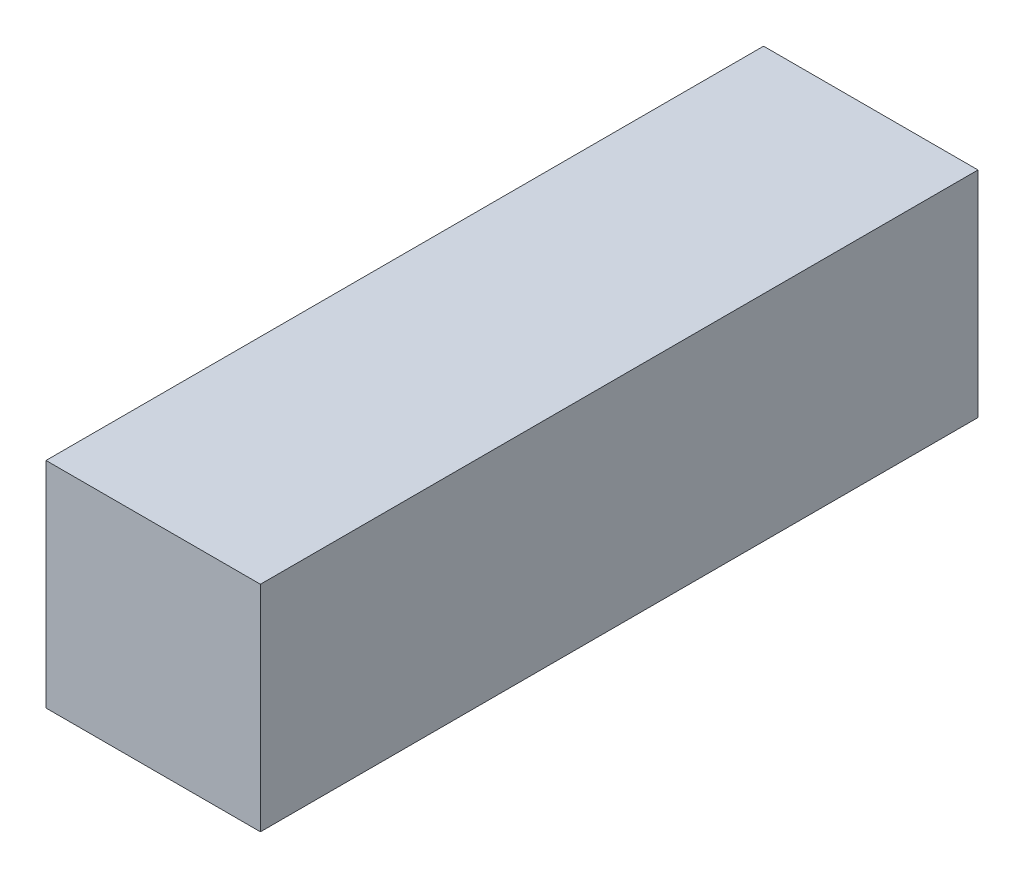
ISO-10303-21;
HEADER;
FILE_DESCRIPTION(('STEP AP214'),'2;1');
FILE_NAME('part.step','',(''),(''),'','','');
FILE_SCHEMA(('AUTOMOTIVE_DESIGN { 1 0 10303 214 1 1 1 1 }'));
ENDSEC;
DATA;
#1=APPLICATION_CONTEXT('core data for automotive mechanical design processes');
#2=APPLICATION_PROTOCOL_DEFINITION('international standard','automotive_design',2000,#1);
#3=PRODUCT_CONTEXT('',#1,'mechanical');
#4=PRODUCT('Part','Part','',(#3));
#5=PRODUCT_RELATED_PRODUCT_CATEGORY('part','',(#4));
#6=PRODUCT_DEFINITION_FORMATION('','',#4);
#7=PRODUCT_DEFINITION_CONTEXT('part definition',#1,'design');
#8=PRODUCT_DEFINITION('design','',#6,#7);
#9=PRODUCT_DEFINITION_SHAPE('','',#8);
#10=(LENGTH_UNIT() NAMED_UNIT(*) SI_UNIT(.MILLI.,.METRE.));
#11=(NAMED_UNIT(*) PLANE_ANGLE_UNIT() SI_UNIT($,.RADIAN.));
#12=(NAMED_UNIT(*) SI_UNIT($,.STERADIAN.) SOLID_ANGLE_UNIT());
#13=UNCERTAINTY_MEASURE_WITH_UNIT(LENGTH_MEASURE(1.E-05),#10,'distance_accuracy_value','');
#14=(GEOMETRIC_REPRESENTATION_CONTEXT(3) GLOBAL_UNCERTAINTY_ASSIGNED_CONTEXT((#13)) GLOBAL_UNIT_ASSIGNED_CONTEXT((#10,
#11,#12)) REPRESENTATION_CONTEXT('',''));
#15=CARTESIAN_POINT('',(0.,0.,0.));
#16=DIRECTION('',(0.,0.,1.));
#17=DIRECTION('',(1.,0.,0.));
#18=AXIS2_PLACEMENT_3D('',#15,#16,#17);
#19=CARTESIAN_POINT('',(0.,0.,8.5));
#20=DIRECTION('',(0.,0.,1.));
#21=DIRECTION('',(1.,0.,0.));
#22=AXIS2_PLACEMENT_3D('',#19,#20,#21);
#23=PLANE('',#22);
#24=DIRECTION('',(0.,1.,0.));
#25=VECTOR('',#24,1.);
#26=CARTESIAN_POINT('',(0.,0.,8.5));
#27=LINE('',#26,#25);
#28=CARTESIAN_POINT('',(0.,0.,8.5));
#29=VERTEX_POINT('',#28);
#30=CARTESIAN_POINT('',(0.,2.54,8.5));
#31=VERTEX_POINT('',#30);
#32=EDGE_CURVE('E69',#29,#31,#27,.T.);
#33=ORIENTED_EDGE('',*,*,#32,.F.);
#34=DIRECTION('',(1.,0.,0.));
#35=VECTOR('',#34,1.);
#36=CARTESIAN_POINT('',(0.,0.,8.5));
#37=LINE('',#36,#35);
#38=CARTESIAN_POINT('',(2.54,0.,8.5));
#39=VERTEX_POINT('',#38);
#40=EDGE_CURVE('E65',#29,#39,#37,.T.);
#41=ORIENTED_EDGE('',*,*,#40,.T.);
#42=DIRECTION('',(0.,1.,0.));
#43=VECTOR('',#42,1.);
#44=CARTESIAN_POINT('',(2.54,0.,8.5));
#45=LINE('',#44,#43);
#46=CARTESIAN_POINT('',(2.54,2.54,8.5));
#47=VERTEX_POINT('',#46);
#48=EDGE_CURVE('E70',#39,#47,#45,.T.);
#49=ORIENTED_EDGE('',*,*,#48,.T.);
#50=DIRECTION('',(1.,0.,0.));
#51=VECTOR('',#50,1.);
#52=CARTESIAN_POINT('',(0.,2.54,8.5));
#53=LINE('',#52,#51);
#54=EDGE_CURVE('E11',#31,#47,#53,.T.);
#55=ORIENTED_EDGE('',*,*,#54,.F.);
#56=EDGE_LOOP('',(#33,#41,#49,#55));
#57=FACE_BOUND('',#56,.T.);
#58=ADVANCED_FACE('F17',(#57),#23,.T.);
#59=CARTESIAN_POINT('',(0.,0.,0.));
#60=DIRECTION('',(0.,0.,1.));
#61=DIRECTION('',(1.,0.,0.));
#62=AXIS2_PLACEMENT_3D('',#59,#60,#61);
#63=PLANE('',#62);
#64=DIRECTION('',(1.,0.,0.));
#65=VECTOR('',#64,1.);
#66=CARTESIAN_POINT('',(0.,2.54,0.));
#67=LINE('',#66,#65);
#68=CARTESIAN_POINT('',(0.,2.54,0.));
#69=VERTEX_POINT('',#68);
#70=CARTESIAN_POINT('',(2.54,2.54,0.));
#71=VERTEX_POINT('',#70);
#72=EDGE_CURVE('E30',#69,#71,#67,.T.);
#73=ORIENTED_EDGE('',*,*,#72,.T.);
#74=DIRECTION('',(0.,1.,0.));
#75=VECTOR('',#74,1.);
#76=CARTESIAN_POINT('',(2.54,0.,0.));
#77=LINE('',#76,#75);
#78=CARTESIAN_POINT('',(2.54,0.,0.));
#79=VERTEX_POINT('',#78);
#80=EDGE_CURVE('E90',#79,#71,#77,.T.);
#81=ORIENTED_EDGE('',*,*,#80,.F.);
#82=DIRECTION('',(1.,0.,0.));
#83=VECTOR('',#82,1.);
#84=CARTESIAN_POINT('',(0.,0.,0.));
#85=LINE('',#84,#83);
#86=CARTESIAN_POINT('',(0.,0.,0.));
#87=VERTEX_POINT('',#86);
#88=EDGE_CURVE('E76',#87,#79,#85,.T.);
#89=ORIENTED_EDGE('',*,*,#88,.F.);
#90=DIRECTION('',(0.,1.,0.));
#91=VECTOR('',#90,1.);
#92=CARTESIAN_POINT('',(0.,0.,0.));
#93=LINE('',#92,#91);
#94=EDGE_CURVE('E96',#87,#69,#93,.T.);
#95=ORIENTED_EDGE('',*,*,#94,.T.);
#96=EDGE_LOOP('',(#73,#81,#89,#95));
#97=FACE_BOUND('',#96,.T.);
#98=ADVANCED_FACE('F19',(#97),#63,.F.);
#99=CARTESIAN_POINT('',(0.,2.54,0.));
#100=DIRECTION('',(0.,1.,0.));
#101=DIRECTION('',(1.,0.,0.));
#102=AXIS2_PLACEMENT_3D('',#99,#100,#101);
#103=PLANE('',#102);
#104=ORIENTED_EDGE('',*,*,#72,.F.);
#105=DIRECTION('',(0.,0.,1.));
#106=VECTOR('',#105,1.);
#107=CARTESIAN_POINT('',(0.,2.54,0.));
#108=LINE('',#107,#106);
#109=EDGE_CURVE('E114',#69,#31,#108,.T.);
#110=ORIENTED_EDGE('',*,*,#109,.T.);
#111=ORIENTED_EDGE('',*,*,#54,.T.);
#112=DIRECTION('',(0.,0.,1.));
#113=VECTOR('',#112,1.);
#114=CARTESIAN_POINT('',(2.54,2.54,0.));
#115=LINE('',#114,#113);
#116=EDGE_CURVE('E83',#71,#47,#115,.T.);
#117=ORIENTED_EDGE('',*,*,#116,.F.);
#118=EDGE_LOOP('',(#104,#110,#111,#117));
#119=FACE_BOUND('',#118,.T.);
#120=ADVANCED_FACE('F106',(#119),#103,.T.);
#121=CARTESIAN_POINT('',(0.,0.,0.));
#122=DIRECTION('',(0.,1.,0.));
#123=DIRECTION('',(1.,0.,0.));
#124=AXIS2_PLACEMENT_3D('',#121,#122,#123);
#125=PLANE('',#124);
#126=DIRECTION('',(0.,0.,1.));
#127=VECTOR('',#126,1.);
#128=CARTESIAN_POINT('',(2.54,0.,0.));
#129=LINE('',#128,#127);
#130=EDGE_CURVE('E85',#79,#39,#129,.T.);
#131=ORIENTED_EDGE('',*,*,#130,.T.);
#132=ORIENTED_EDGE('',*,*,#40,.F.);
#133=DIRECTION('',(0.,0.,1.));
#134=VECTOR('',#133,1.);
#135=CARTESIAN_POINT('',(0.,0.,0.));
#136=LINE('',#135,#134);
#137=EDGE_CURVE('E89',#87,#29,#136,.T.);
#138=ORIENTED_EDGE('',*,*,#137,.F.);
#139=ORIENTED_EDGE('',*,*,#88,.T.);
#140=EDGE_LOOP('',(#131,#132,#138,#139));
#141=FACE_BOUND('',#140,.T.);
#142=ADVANCED_FACE('F88',(#141),#125,.F.);
#143=CARTESIAN_POINT('',(2.54,0.,0.));
#144=DIRECTION('',(1.,0.,0.));
#145=DIRECTION('',(0.,1.,0.));
#146=AXIS2_PLACEMENT_3D('',#143,#144,#145);
#147=PLANE('',#146);
#148=ORIENTED_EDGE('',*,*,#130,.F.);
#149=ORIENTED_EDGE('',*,*,#80,.T.);
#150=ORIENTED_EDGE('',*,*,#116,.T.);
#151=ORIENTED_EDGE('',*,*,#48,.F.);
#152=EDGE_LOOP('',(#148,#149,#150,#151));
#153=FACE_BOUND('',#152,.T.);
#154=ADVANCED_FACE('F79',(#153),#147,.T.);
#155=CARTESIAN_POINT('',(0.,0.,0.));
#156=DIRECTION('',(1.,0.,0.));
#157=DIRECTION('',(0.,1.,0.));
#158=AXIS2_PLACEMENT_3D('',#155,#156,#157);
#159=PLANE('',#158);
#160=ORIENTED_EDGE('',*,*,#32,.T.);
#161=ORIENTED_EDGE('',*,*,#109,.F.);
#162=ORIENTED_EDGE('',*,*,#94,.F.);
#163=ORIENTED_EDGE('',*,*,#137,.T.);
#164=EDGE_LOOP('',(#160,#161,#162,#163));
#165=FACE_BOUND('',#164,.T.);
#166=ADVANCED_FACE('F121',(#165),#159,.F.);
#167=CLOSED_SHELL('',(#58,#98,#120,#142,#154,#166));
#168=MANIFOLD_SOLID_BREP('B1',#167);
#169=ADVANCED_BREP_SHAPE_REPRESENTATION('',(#18,#168),#14);
#170=SHAPE_DEFINITION_REPRESENTATION(#9,#169);
ENDSEC;
END-ISO-10303-21;
